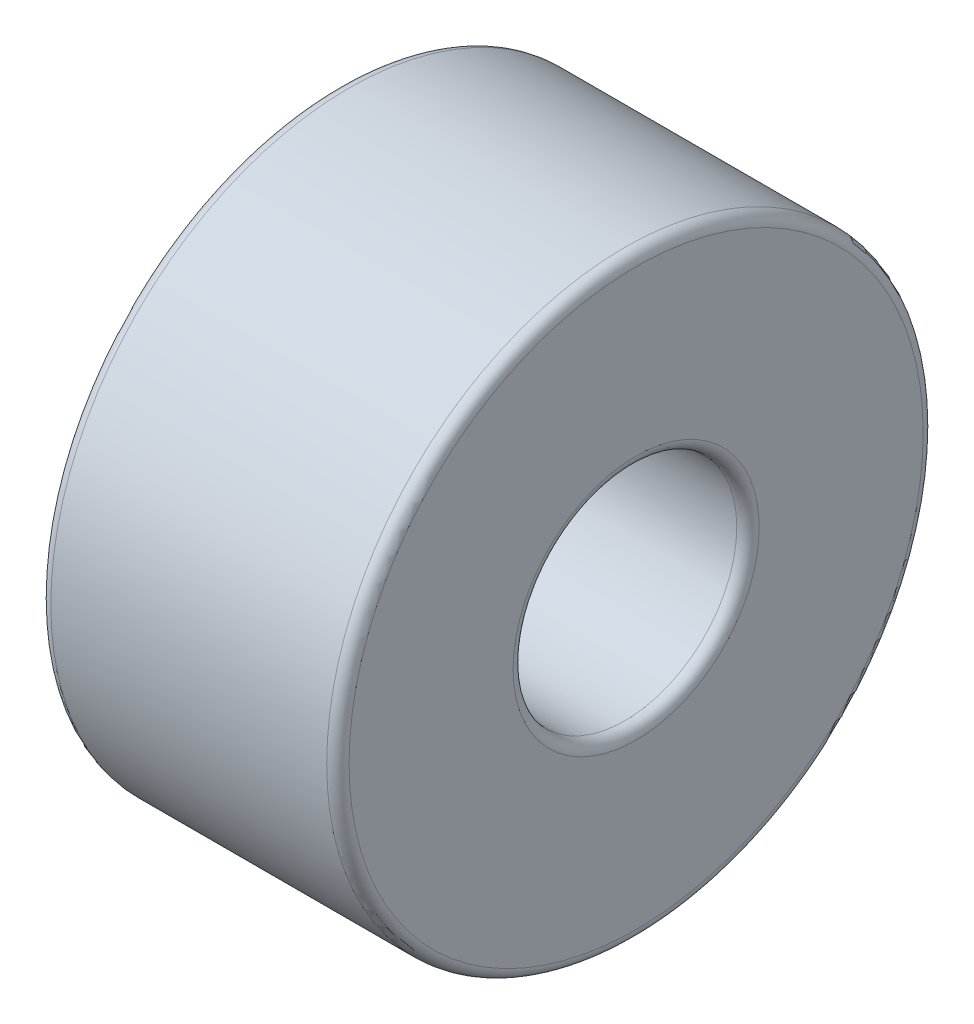
ISO-10303-21;
HEADER;
FILE_DESCRIPTION(('STEP AP214'),'2;1');
FILE_NAME('part.step','',(''),(''),'','','');
FILE_SCHEMA(('AUTOMOTIVE_DESIGN { 1 0 10303 214 1 1 1 1 }'));
ENDSEC;
DATA;
#1=APPLICATION_CONTEXT('core data for automotive mechanical design processes');
#2=APPLICATION_PROTOCOL_DEFINITION('international standard','automotive_design',2000,#1);
#3=PRODUCT_CONTEXT('',#1,'mechanical');
#4=PRODUCT('Part','Part','',(#3));
#5=PRODUCT_RELATED_PRODUCT_CATEGORY('part','',(#4));
#6=PRODUCT_DEFINITION_FORMATION('','',#4);
#7=PRODUCT_DEFINITION_CONTEXT('part definition',#1,'design');
#8=PRODUCT_DEFINITION('design','',#6,#7);
#9=PRODUCT_DEFINITION_SHAPE('','',#8);
#10=(LENGTH_UNIT() NAMED_UNIT(*) SI_UNIT(.MILLI.,.METRE.));
#11=(NAMED_UNIT(*) PLANE_ANGLE_UNIT() SI_UNIT($,.RADIAN.));
#12=(NAMED_UNIT(*) SI_UNIT($,.STERADIAN.) SOLID_ANGLE_UNIT());
#13=UNCERTAINTY_MEASURE_WITH_UNIT(LENGTH_MEASURE(1.E-05),#10,'distance_accuracy_value','');
#14=(GEOMETRIC_REPRESENTATION_CONTEXT(3) GLOBAL_UNCERTAINTY_ASSIGNED_CONTEXT((#13)) GLOBAL_UNIT_ASSIGNED_CONTEXT((#10,
#11,#12)) REPRESENTATION_CONTEXT('',''));
#15=CARTESIAN_POINT('',(0.,0.,0.));
#16=DIRECTION('',(0.,0.,1.));
#17=DIRECTION('',(1.,0.,0.));
#18=AXIS2_PLACEMENT_3D('',#15,#16,#17);
#19=CARTESIAN_POINT('',(0.15,0.,0.));
#20=DIRECTION('',(-1.,0.,0.));
#21=DIRECTION('',(0.,0.,1.));
#22=AXIS2_PLACEMENT_3D('',#19,#20,#21);
#23=CYLINDRICAL_SURFACE('',#22,1.5);
#24=CARTESIAN_POINT('',(3.85,0.,0.));
#25=DIRECTION('',(-1.,0.,0.));
#26=DIRECTION('',(0.,0.,1.));
#27=AXIS2_PLACEMENT_3D('',#24,#25,#26);
#28=CIRCLE('',#27,1.5);
#29=CARTESIAN_POINT('',(3.85,0.,1.5));
#30=VERTEX_POINT('',#29);
#31=EDGE_CURVE('E8',#30,#30,#28,.T.);
#32=ORIENTED_EDGE('',*,*,#31,.F.);
#33=EDGE_LOOP('',(#32));
#34=FACE_BOUND('',#33,.T.);
#35=CARTESIAN_POINT('',(0.15,0.,0.));
#36=DIRECTION('',(-1.,0.,0.));
#37=DIRECTION('',(0.,0.,1.));
#38=AXIS2_PLACEMENT_3D('',#35,#36,#37);
#39=CIRCLE('',#38,1.5);
#40=CARTESIAN_POINT('',(0.15,0.,1.5));
#41=VERTEX_POINT('',#40);
#42=EDGE_CURVE('E83',#41,#41,#39,.T.);
#43=ORIENTED_EDGE('',*,*,#42,.T.);
#44=EDGE_LOOP('',(#43));
#45=FACE_BOUND('',#44,.T.);
#46=ADVANCED_FACE('F14',(#34,#45),#23,.F.);
#47=CARTESIAN_POINT('',(3.85,0.,0.));
#48=DIRECTION('',(-1.,0.,0.));
#49=DIRECTION('',(0.,0.,1.));
#50=AXIS2_PLACEMENT_3D('',#47,#48,#49);
#51=TOROIDAL_SURFACE('',#50,1.65,0.15);
#52=CARTESIAN_POINT('',(4.,0.,0.));
#53=DIRECTION('',(-1.,0.,0.));
#54=DIRECTION('',(0.,0.,1.));
#55=AXIS2_PLACEMENT_3D('',#52,#53,#54);
#56=CIRCLE('',#55,1.65);
#57=CARTESIAN_POINT('',(4.,0.,1.65));
#58=VERTEX_POINT('',#57);
#59=EDGE_CURVE('E23',#58,#58,#56,.T.);
#60=ORIENTED_EDGE('',*,*,#59,.F.);
#61=EDGE_LOOP('',(#60));
#62=FACE_BOUND('',#61,.T.);
#63=ORIENTED_EDGE('',*,*,#31,.T.);
#64=EDGE_LOOP('',(#63));
#65=FACE_BOUND('',#64,.T.);
#66=ADVANCED_FACE('F113',(#62,#65),#51,.T.);
#67=CARTESIAN_POINT('',(4.,1.65,0.));
#68=DIRECTION('',(-1.,0.,0.));
#69=DIRECTION('',(0.,0.,1.));
#70=AXIS2_PLACEMENT_3D('',#67,#68,#69);
#71=PLANE('',#70);
#72=CARTESIAN_POINT('',(4.,0.,0.));
#73=DIRECTION('',(-1.,0.,0.));
#74=DIRECTION('',(0.,0.,1.));
#75=AXIS2_PLACEMENT_3D('',#72,#73,#74);
#76=CIRCLE('',#75,3.85);
#77=CARTESIAN_POINT('',(4.,0.,3.85));
#78=VERTEX_POINT('',#77);
#79=EDGE_CURVE('E33',#78,#78,#76,.T.);
#80=ORIENTED_EDGE('',*,*,#79,.F.);
#81=EDGE_LOOP('',(#80));
#82=FACE_BOUND('',#81,.T.);
#83=ORIENTED_EDGE('',*,*,#59,.T.);
#84=EDGE_LOOP('',(#83));
#85=FACE_BOUND('',#84,.T.);
#86=ADVANCED_FACE('F110',(#82,#85),#71,.F.);
#87=CARTESIAN_POINT('',(3.85,0.,0.));
#88=DIRECTION('',(-1.,0.,0.));
#89=DIRECTION('',(0.,0.,1.));
#90=AXIS2_PLACEMENT_3D('',#87,#88,#89);
#91=TOROIDAL_SURFACE('',#90,3.85,0.15);
#92=CARTESIAN_POINT('',(3.85,0.,0.));
#93=DIRECTION('',(-1.,0.,0.));
#94=DIRECTION('',(0.,0.,1.));
#95=AXIS2_PLACEMENT_3D('',#92,#93,#94);
#96=CIRCLE('',#95,4.);
#97=CARTESIAN_POINT('',(3.85,0.,4.));
#98=VERTEX_POINT('',#97);
#99=EDGE_CURVE('E98',#98,#98,#96,.T.);
#100=ORIENTED_EDGE('',*,*,#99,.F.);
#101=EDGE_LOOP('',(#100));
#102=FACE_BOUND('',#101,.T.);
#103=ORIENTED_EDGE('',*,*,#79,.T.);
#104=EDGE_LOOP('',(#103));
#105=FACE_BOUND('',#104,.T.);
#106=ADVANCED_FACE('F108',(#102,#105),#91,.T.);
#107=CARTESIAN_POINT('',(0.15,0.,0.));
#108=DIRECTION('',(-1.,0.,0.));
#109=DIRECTION('',(0.,0.,1.));
#110=AXIS2_PLACEMENT_3D('',#107,#108,#109);
#111=CYLINDRICAL_SURFACE('',#110,4.);
#112=CARTESIAN_POINT('',(0.15,0.,0.));
#113=DIRECTION('',(-1.,0.,0.));
#114=DIRECTION('',(0.,0.,1.));
#115=AXIS2_PLACEMENT_3D('',#112,#113,#114);
#116=CIRCLE('',#115,4.);
#117=CARTESIAN_POINT('',(0.15,0.,4.));
#118=VERTEX_POINT('',#117);
#119=EDGE_CURVE('E94',#118,#118,#116,.T.);
#120=ORIENTED_EDGE('',*,*,#119,.F.);
#121=EDGE_LOOP('',(#120));
#122=FACE_BOUND('',#121,.T.);
#123=ORIENTED_EDGE('',*,*,#99,.T.);
#124=EDGE_LOOP('',(#123));
#125=FACE_BOUND('',#124,.T.);
#126=ADVANCED_FACE('F126',(#122,#125),#111,.T.);
#127=CARTESIAN_POINT('',(0.15,0.,0.));
#128=DIRECTION('',(-1.,0.,0.));
#129=DIRECTION('',(0.,0.,1.));
#130=AXIS2_PLACEMENT_3D('',#127,#128,#129);
#131=TOROIDAL_SURFACE('',#130,3.85,0.15);
#132=CARTESIAN_POINT('',(0.,0.,0.));
#133=DIRECTION('',(-1.,0.,0.));
#134=DIRECTION('',(0.,0.,1.));
#135=AXIS2_PLACEMENT_3D('',#132,#133,#134);
#136=CIRCLE('',#135,3.85);
#137=CARTESIAN_POINT('',(0.,0.,3.85));
#138=VERTEX_POINT('',#137);
#139=EDGE_CURVE('E90',#138,#138,#136,.T.);
#140=ORIENTED_EDGE('',*,*,#139,.F.);
#141=EDGE_LOOP('',(#140));
#142=FACE_BOUND('',#141,.T.);
#143=ORIENTED_EDGE('',*,*,#119,.T.);
#144=EDGE_LOOP('',(#143));
#145=FACE_BOUND('',#144,.T.);
#146=ADVANCED_FACE('F130',(#142,#145),#131,.T.);
#147=CARTESIAN_POINT('',(0.,1.65,0.));
#148=DIRECTION('',(-1.,0.,0.));
#149=DIRECTION('',(0.,0.,1.));
#150=AXIS2_PLACEMENT_3D('',#147,#148,#149);
#151=PLANE('',#150);
#152=ORIENTED_EDGE('',*,*,#139,.T.);
#153=EDGE_LOOP('',(#152));
#154=FACE_BOUND('',#153,.T.);
#155=CARTESIAN_POINT('',(0.,0.,0.));
#156=DIRECTION('',(-1.,0.,0.));
#157=DIRECTION('',(0.,0.,1.));
#158=AXIS2_PLACEMENT_3D('',#155,#156,#157);
#159=CIRCLE('',#158,1.65);
#160=CARTESIAN_POINT('',(0.,0.,1.65));
#161=VERTEX_POINT('',#160);
#162=EDGE_CURVE('E86',#161,#161,#159,.T.);
#163=ORIENTED_EDGE('',*,*,#162,.F.);
#164=EDGE_LOOP('',(#163));
#165=FACE_BOUND('',#164,.T.);
#166=ADVANCED_FACE('F134',(#154,#165),#151,.T.);
#167=CARTESIAN_POINT('',(0.15,0.,0.));
#168=DIRECTION('',(-1.,0.,0.));
#169=DIRECTION('',(0.,0.,1.));
#170=AXIS2_PLACEMENT_3D('',#167,#168,#169);
#171=TOROIDAL_SURFACE('',#170,1.65,0.15);
#172=ORIENTED_EDGE('',*,*,#42,.F.);
#173=EDGE_LOOP('',(#172));
#174=FACE_BOUND('',#173,.T.);
#175=ORIENTED_EDGE('',*,*,#162,.T.);
#176=EDGE_LOOP('',(#175));
#177=FACE_BOUND('',#176,.T.);
#178=ADVANCED_FACE('F138',(#174,#177),#171,.T.);
#179=CLOSED_SHELL('',(#46,#66,#86,#106,#126,#146,#166,#178));
#180=CARTESIAN_POINT('',(0.75,0.,0.));
#181=DIRECTION('',(-1.,0.,0.));
#182=DIRECTION('',(0.,0.,-1.));
#183=AXIS2_PLACEMENT_3D('',#180,#181,#182);
#184=CYLINDRICAL_SURFACE('',#183,2.6825);
#185=CARTESIAN_POINT('',(1.9325,0.,0.));
#186=DIRECTION('',(-1.,0.,0.));
#187=DIRECTION('',(0.,-1.,0.));
#188=AXIS2_PLACEMENT_3D('',#185,#186,#187);
#189=CIRCLE('',#188,2.6825);
#190=CARTESIAN_POINT('',(1.9325,-2.6825,0.));
#191=VERTEX_POINT('',#190);
#192=EDGE_CURVE('E63',#191,#191,#189,.T.);
#193=ORIENTED_EDGE('',*,*,#192,.T.);
#194=EDGE_LOOP('',(#193));
#195=FACE_BOUND('',#194,.T.);
#196=CARTESIAN_POINT('',(0.75,0.,0.));
#197=DIRECTION('',(-1.,0.,0.));
#198=DIRECTION('',(0.,0.,-1.));
#199=AXIS2_PLACEMENT_3D('',#196,#197,#198);
#200=CIRCLE('',#199,2.6825);
#201=CARTESIAN_POINT('',(0.75,0.,-2.6825));
#202=VERTEX_POINT('',#201);
#203=EDGE_CURVE('E79',#202,#202,#200,.T.);
#204=ORIENTED_EDGE('',*,*,#203,.F.);
#205=EDGE_LOOP('',(#204));
#206=FACE_BOUND('',#205,.T.);
#207=ADVANCED_FACE('F149',(#195,#206),#184,.T.);
#208=CARTESIAN_POINT('',(0.75,0.,0.));
#209=DIRECTION('',(-1.,0.,0.));
#210=DIRECTION('',(0.,0.,-1.));
#211=AXIS2_PLACEMENT_3D('',#208,#209,#210);
#212=CYLINDRICAL_SURFACE('',#211,2.8175);
#213=CARTESIAN_POINT('',(1.9325,0.,0.));
#214=DIRECTION('',(-1.,0.,0.));
#215=DIRECTION('',(0.,-1.,0.));
#216=AXIS2_PLACEMENT_3D('',#213,#214,#215);
#217=CIRCLE('',#216,2.8175);
#218=CARTESIAN_POINT('',(1.9325,-2.8175,0.));
#219=VERTEX_POINT('',#218);
#220=EDGE_CURVE('E17',#219,#219,#217,.F.);
#221=ORIENTED_EDGE('',*,*,#220,.T.);
#222=EDGE_LOOP('',(#221));
#223=FACE_BOUND('',#222,.T.);
#224=CARTESIAN_POINT('',(0.75,0.,0.));
#225=DIRECTION('',(-1.,0.,0.));
#226=DIRECTION('',(0.,0.,-1.));
#227=AXIS2_PLACEMENT_3D('',#224,#225,#226);
#228=CIRCLE('',#227,2.8175);
#229=CARTESIAN_POINT('',(0.75,0.,-2.8175));
#230=VERTEX_POINT('',#229);
#231=EDGE_CURVE('E75',#230,#230,#228,.T.);
#232=ORIENTED_EDGE('',*,*,#231,.T.);
#233=EDGE_LOOP('',(#232));
#234=FACE_BOUND('',#233,.T.);
#235=ADVANCED_FACE('F155',(#223,#234),#212,.F.);
#236=CARTESIAN_POINT('',(0.75,-2.6825,0.));
#237=DIRECTION('',(-1.,0.,0.));
#238=DIRECTION('',(0.,0.,-1.));
#239=AXIS2_PLACEMENT_3D('',#236,#237,#238);
#240=PLANE('',#239);
#241=ORIENTED_EDGE('',*,*,#231,.F.);
#242=EDGE_LOOP('',(#241));
#243=FACE_BOUND('',#242,.T.);
#244=ORIENTED_EDGE('',*,*,#203,.T.);
#245=EDGE_LOOP('',(#244));
#246=FACE_BOUND('',#245,.T.);
#247=ADVANCED_FACE('F151',(#243,#246),#240,.F.);
#248=CARTESIAN_POINT('',(1.9325,-2.33333333333333,0.));
#249=DIRECTION('',(-1.,0.,0.));
#250=DIRECTION('',(0.,0.,-1.));
#251=AXIS2_PLACEMENT_3D('',#248,#249,#250);
#252=PLANE('',#251);
#253=CARTESIAN_POINT('',(1.9325,0.,0.));
#254=DIRECTION('',(-1.,0.,0.));
#255=DIRECTION('',(0.,0.,-1.));
#256=AXIS2_PLACEMENT_3D('',#253,#254,#255);
#257=CIRCLE('',#256,3.16666666666666);
#258=CARTESIAN_POINT('',(1.9325,0.,-3.16666666666666));
#259=VERTEX_POINT('',#258);
#260=EDGE_CURVE('E51',#259,#259,#257,.T.);
#261=ORIENTED_EDGE('',*,*,#260,.F.);
#262=EDGE_LOOP('',(#261));
#263=FACE_BOUND('',#262,.T.);
#264=ORIENTED_EDGE('',*,*,#220,.F.);
#265=EDGE_LOOP('',(#264));
#266=FACE_BOUND('',#265,.T.);
#267=ADVANCED_FACE('F154',(#263,#266),#252,.F.);
#268=CARTESIAN_POINT('',(1.9325,0.,0.));
#269=DIRECTION('',(-1.,0.,0.));
#270=DIRECTION('',(0.,0.,-1.));
#271=AXIS2_PLACEMENT_3D('',#268,#269,#270);
#272=CYLINDRICAL_SURFACE('',#271,3.16666666666666);
#273=CARTESIAN_POINT('',(2.0675,0.,0.));
#274=DIRECTION('',(-1.,0.,0.));
#275=DIRECTION('',(0.,0.,-1.));
#276=AXIS2_PLACEMENT_3D('',#273,#274,#275);
#277=CIRCLE('',#276,3.16666666666666);
#278=CARTESIAN_POINT('',(2.0675,0.,-3.16666666666666));
#279=VERTEX_POINT('',#278);
#280=EDGE_CURVE('E59',#279,#279,#277,.T.);
#281=ORIENTED_EDGE('',*,*,#280,.F.);
#282=EDGE_LOOP('',(#281));
#283=FACE_BOUND('',#282,.T.);
#284=ORIENTED_EDGE('',*,*,#260,.T.);
#285=EDGE_LOOP('',(#284));
#286=FACE_BOUND('',#285,.T.);
#287=ADVANCED_FACE('F171',(#283,#286),#272,.F.);
#288=CARTESIAN_POINT('',(2.0675,-3.16666666666666,0.));
#289=DIRECTION('',(1.,0.,0.));
#290=DIRECTION('',(0.,0.,1.));
#291=AXIS2_PLACEMENT_3D('',#288,#289,#290);
#292=PLANE('',#291);
#293=ORIENTED_EDGE('',*,*,#280,.T.);
#294=EDGE_LOOP('',(#293));
#295=FACE_BOUND('',#294,.T.);
#296=CARTESIAN_POINT('',(2.0675,0.,0.));
#297=DIRECTION('',(1.,0.,0.));
#298=DIRECTION('',(0.,1.,0.));
#299=AXIS2_PLACEMENT_3D('',#296,#297,#298);
#300=CIRCLE('',#299,2.8175);
#301=CARTESIAN_POINT('',(2.0675,2.8175,0.));
#302=VERTEX_POINT('',#301);
#303=EDGE_CURVE('E36',#302,#302,#300,.F.);
#304=ORIENTED_EDGE('',*,*,#303,.F.);
#305=EDGE_LOOP('',(#304));
#306=FACE_BOUND('',#305,.T.);
#307=ADVANCED_FACE('F170',(#295,#306),#292,.F.);
#308=CARTESIAN_POINT('',(1.9325,0.,0.));
#309=DIRECTION('',(-1.,0.,0.));
#310=DIRECTION('',(0.,0.,-1.));
#311=AXIS2_PLACEMENT_3D('',#308,#309,#310);
#312=CIRCLE('',#311,2.33333333333333);
#313=CARTESIAN_POINT('',(1.9325,0.,-2.33333333333333));
#314=VERTEX_POINT('',#313);
#315=EDGE_CURVE('E40',#314,#314,#312,.T.);
#316=ORIENTED_EDGE('',*,*,#315,.T.);
#317=EDGE_LOOP('',(#316));
#318=FACE_BOUND('',#317,.T.);
#319=ORIENTED_EDGE('',*,*,#192,.F.);
#320=EDGE_LOOP('',(#319));
#321=FACE_BOUND('',#320,.T.);
#322=ADVANCED_FACE('F167',(#318,#321),#252,.F.);
#323=CARTESIAN_POINT('',(2.0675,0.,0.));
#324=DIRECTION('',(-1.,0.,0.));
#325=DIRECTION('',(0.,0.,-1.));
#326=AXIS2_PLACEMENT_3D('',#323,#324,#325);
#327=CIRCLE('',#326,2.33333333333333);
#328=CARTESIAN_POINT('',(2.0675,0.,-2.33333333333333));
#329=VERTEX_POINT('',#328);
#330=EDGE_CURVE('E231',#329,#329,#327,.T.);
#331=ORIENTED_EDGE('',*,*,#330,.F.);
#332=EDGE_LOOP('',(#331));
#333=FACE_BOUND('',#332,.T.);
#334=CARTESIAN_POINT('',(2.0675,0.,0.));
#335=DIRECTION('',(1.,0.,0.));
#336=DIRECTION('',(0.,1.,0.));
#337=AXIS2_PLACEMENT_3D('',#334,#335,#336);
#338=CIRCLE('',#337,2.6825);
#339=CARTESIAN_POINT('',(2.0675,2.6825,0.));
#340=VERTEX_POINT('',#339);
#341=EDGE_CURVE('E39',#340,#340,#338,.T.);
#342=ORIENTED_EDGE('',*,*,#341,.F.);
#343=EDGE_LOOP('',(#342));
#344=FACE_BOUND('',#343,.T.);
#345=ADVANCED_FACE('F165',(#333,#344),#292,.F.);
#346=CARTESIAN_POINT('',(1.9325,0.,0.));
#347=DIRECTION('',(-1.,0.,0.));
#348=DIRECTION('',(0.,0.,-1.));
#349=AXIS2_PLACEMENT_3D('',#346,#347,#348);
#350=CYLINDRICAL_SURFACE('',#349,2.33333333333333);
#351=ORIENTED_EDGE('',*,*,#315,.F.);
#352=EDGE_LOOP('',(#351));
#353=FACE_BOUND('',#352,.T.);
#354=ORIENTED_EDGE('',*,*,#330,.T.);
#355=EDGE_LOOP('',(#354));
#356=FACE_BOUND('',#355,.T.);
#357=ADVANCED_FACE('F147',(#353,#356),#350,.T.);
#358=ORIENTED_EDGE('',*,*,#341,.T.);
#359=EDGE_LOOP('',(#358));
#360=FACE_BOUND('',#359,.T.);
#361=CARTESIAN_POINT('',(3.25,0.,0.));
#362=DIRECTION('',(-1.,0.,0.));
#363=DIRECTION('',(0.,0.,-1.));
#364=AXIS2_PLACEMENT_3D('',#361,#362,#363);
#365=CIRCLE('',#364,2.6825);
#366=CARTESIAN_POINT('',(3.25,0.,-2.6825));
#367=VERTEX_POINT('',#366);
#368=EDGE_CURVE('E67',#367,#367,#365,.T.);
#369=ORIENTED_EDGE('',*,*,#368,.T.);
#370=EDGE_LOOP('',(#369));
#371=FACE_BOUND('',#370,.T.);
#372=ADVANCED_FACE('F143',(#360,#371),#184,.T.);
#373=CARTESIAN_POINT('',(3.25,-2.8175,0.));
#374=DIRECTION('',(1.,0.,0.));
#375=DIRECTION('',(0.,0.,1.));
#376=AXIS2_PLACEMENT_3D('',#373,#374,#375);
#377=PLANE('',#376);
#378=ORIENTED_EDGE('',*,*,#368,.F.);
#379=EDGE_LOOP('',(#378));
#380=FACE_BOUND('',#379,.T.);
#381=CARTESIAN_POINT('',(3.25,0.,0.));
#382=DIRECTION('',(-1.,0.,0.));
#383=DIRECTION('',(0.,0.,-1.));
#384=AXIS2_PLACEMENT_3D('',#381,#382,#383);
#385=CIRCLE('',#384,2.8175);
#386=CARTESIAN_POINT('',(3.25,0.,-2.8175));
#387=VERTEX_POINT('',#386);
#388=EDGE_CURVE('E71',#387,#387,#385,.T.);
#389=ORIENTED_EDGE('',*,*,#388,.T.);
#390=EDGE_LOOP('',(#389));
#391=FACE_BOUND('',#390,.T.);
#392=ADVANCED_FACE('F146',(#380,#391),#377,.F.);
#393=ORIENTED_EDGE('',*,*,#303,.T.);
#394=EDGE_LOOP('',(#393));
#395=FACE_BOUND('',#394,.T.);
#396=ORIENTED_EDGE('',*,*,#388,.F.);
#397=EDGE_LOOP('',(#396));
#398=FACE_BOUND('',#397,.T.);
#399=ADVANCED_FACE('F157',(#395,#398),#212,.F.);
#400=CLOSED_SHELL('',(#207,#235,#247,#267,#287,#307,#322,#345,#357,#372,#392,#399));
#401=ORIENTED_CLOSED_SHELL('',*,#400,.T.);
#402=BREP_WITH_VOIDS('B1',#179,(#401));
#403=ADVANCED_BREP_SHAPE_REPRESENTATION('',(#18,#402),#14);
#404=SHAPE_DEFINITION_REPRESENTATION(#9,#403);
ENDSEC;
END-ISO-10303-21;
